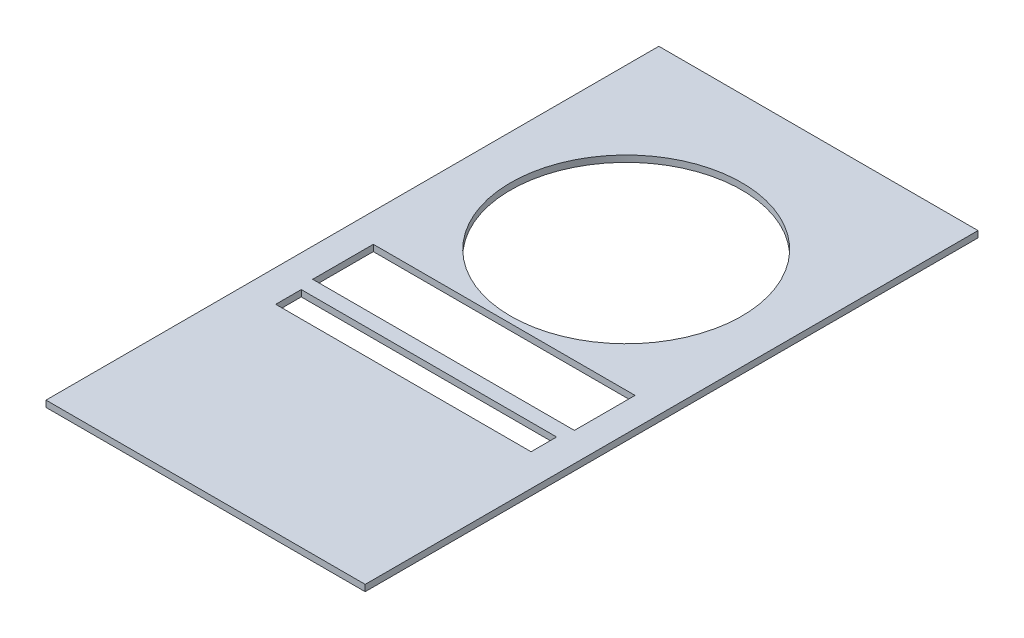
ISO-10303-21;
HEADER;
FILE_DESCRIPTION(('STEP AP214'),'2;1');
FILE_NAME('part.step','',(''),(''),'','','');
FILE_SCHEMA(('AUTOMOTIVE_DESIGN { 1 0 10303 214 1 1 1 1 }'));
ENDSEC;
DATA;
#1=APPLICATION_CONTEXT('core data for automotive mechanical design processes');
#2=APPLICATION_PROTOCOL_DEFINITION('international standard','automotive_design',2000,#1);
#3=PRODUCT_CONTEXT('',#1,'mechanical');
#4=PRODUCT('Part','Part','',(#3));
#5=PRODUCT_RELATED_PRODUCT_CATEGORY('part','',(#4));
#6=PRODUCT_DEFINITION_FORMATION('','',#4);
#7=PRODUCT_DEFINITION_CONTEXT('part definition',#1,'design');
#8=PRODUCT_DEFINITION('design','',#6,#7);
#9=PRODUCT_DEFINITION_SHAPE('','',#8);
#10=(LENGTH_UNIT() NAMED_UNIT(*) SI_UNIT(.MILLI.,.METRE.));
#11=(NAMED_UNIT(*) PLANE_ANGLE_UNIT() SI_UNIT($,.RADIAN.));
#12=(NAMED_UNIT(*) SI_UNIT($,.STERADIAN.) SOLID_ANGLE_UNIT());
#13=UNCERTAINTY_MEASURE_WITH_UNIT(LENGTH_MEASURE(1.E-05),#10,'distance_accuracy_value','');
#14=(GEOMETRIC_REPRESENTATION_CONTEXT(3) GLOBAL_UNCERTAINTY_ASSIGNED_CONTEXT((#13)) GLOBAL_UNIT_ASSIGNED_CONTEXT((#10,
#11,#12)) REPRESENTATION_CONTEXT('',''));
#15=CARTESIAN_POINT('',(0.,0.,0.));
#16=DIRECTION('',(0.,0.,1.));
#17=DIRECTION('',(1.,0.,0.));
#18=AXIS2_PLACEMENT_3D('',#15,#16,#17);
#19=CARTESIAN_POINT('',(0.,3.175,0.));
#20=DIRECTION('',(0.,-1.,0.));
#21=DIRECTION('',(0.,0.,-1.));
#22=AXIS2_PLACEMENT_3D('',#19,#20,#21);
#23=PLANE('',#22);
#24=DIRECTION('',(0.,0.,1.));
#25=VECTOR('',#24,1.);
#26=CARTESIAN_POINT('',(14.2875,3.175,-148.513620025453));
#27=LINE('',#26,#25);
#28=CARTESIAN_POINT('',(14.2875,3.175,-148.513620025453));
#29=VERTEX_POINT('',#28);
#30=CARTESIAN_POINT('',(14.2875,3.175,-118.351120025453));
#31=VERTEX_POINT('',#30);
#32=EDGE_CURVE('E163',#29,#31,#27,.T.);
#33=ORIENTED_EDGE('',*,*,#32,.F.);
#34=DIRECTION('',(-1.,0.,0.));
#35=VECTOR('',#34,1.);
#36=CARTESIAN_POINT('',(14.2875,3.175,-148.513620025453));
#37=LINE('',#36,#35);
#38=CARTESIAN_POINT('',(144.4625,3.175,-148.513620025453));
#39=VERTEX_POINT('',#38);
#40=EDGE_CURVE('E175',#39,#29,#37,.T.);
#41=ORIENTED_EDGE('',*,*,#40,.F.);
#42=DIRECTION('',(0.,0.,-1.));
#43=VECTOR('',#42,1.);
#44=CARTESIAN_POINT('',(144.4625,3.175,-148.513620025453));
#45=LINE('',#44,#43);
#46=CARTESIAN_POINT('',(144.4625,3.175,-118.351120025453));
#47=VERTEX_POINT('',#46);
#48=EDGE_CURVE('E166',#47,#39,#45,.T.);
#49=ORIENTED_EDGE('',*,*,#48,.F.);
#50=DIRECTION('',(1.,0.,0.));
#51=VECTOR('',#50,1.);
#52=CARTESIAN_POINT('',(14.2875,3.175,-118.351120025453));
#53=LINE('',#52,#51);
#54=EDGE_CURVE('E167',#31,#47,#53,.T.);
#55=ORIENTED_EDGE('',*,*,#54,.F.);
#56=EDGE_LOOP('',(#33,#41,#49,#55));
#57=FACE_BOUND('',#56,.T.);
#58=DIRECTION('',(0.,0.,1.));
#59=VECTOR('',#58,1.);
#60=CARTESIAN_POINT('',(0.,3.175,0.));
#61=LINE('',#60,#59);
#62=CARTESIAN_POINT('',(0.,3.175,-304.8));
#63=VERTEX_POINT('',#62);
#64=CARTESIAN_POINT('',(0.,3.175,0.));
#65=VERTEX_POINT('',#64);
#66=EDGE_CURVE('E203',#63,#65,#61,.T.);
#67=ORIENTED_EDGE('',*,*,#66,.T.);
#68=DIRECTION('',(1.,0.,0.));
#69=VECTOR('',#68,1.);
#70=CARTESIAN_POINT('',(0.,3.175,0.));
#71=LINE('',#70,#69);
#72=CARTESIAN_POINT('',(158.75,3.175,0.));
#73=VERTEX_POINT('',#72);
#74=EDGE_CURVE('E204',#65,#73,#71,.T.);
#75=ORIENTED_EDGE('',*,*,#74,.T.);
#76=DIRECTION('',(0.,0.,-1.));
#77=VECTOR('',#76,1.);
#78=CARTESIAN_POINT('',(158.75,3.175,0.));
#79=LINE('',#78,#77);
#80=CARTESIAN_POINT('',(158.75,3.175,-304.8));
#81=VERTEX_POINT('',#80);
#82=EDGE_CURVE('E210',#73,#81,#79,.T.);
#83=ORIENTED_EDGE('',*,*,#82,.T.);
#84=DIRECTION('',(-1.,0.,0.));
#85=VECTOR('',#84,1.);
#86=CARTESIAN_POINT('',(0.,3.175,-304.8));
#87=LINE('',#86,#85);
#88=EDGE_CURVE('E207',#81,#63,#87,.T.);
#89=ORIENTED_EDGE('',*,*,#88,.T.);
#90=EDGE_LOOP('',(#67,#75,#83,#89));
#91=FACE_BOUND('',#90,.T.);
#92=CARTESIAN_POINT('',(79.375,3.175,-209.2));
#93=DIRECTION('',(0.,1.,0.));
#94=DIRECTION('',(0.,0.,1.));
#95=AXIS2_PLACEMENT_3D('',#92,#93,#94);
#96=CIRCLE('',#95,57.5);
#97=CARTESIAN_POINT('',(79.375,3.175,-151.7));
#98=VERTEX_POINT('',#97);
#99=EDGE_CURVE('E193',#98,#98,#96,.T.);
#100=ORIENTED_EDGE('',*,*,#99,.F.);
#101=EDGE_LOOP('',(#100));
#102=FACE_BOUND('',#101,.T.);
#103=DIRECTION('',(0.,0.,1.));
#104=VECTOR('',#103,1.);
#105=CARTESIAN_POINT('',(15.875,3.175,-98.3841921115399));
#106=LINE('',#105,#104);
#107=CARTESIAN_POINT('',(15.875,3.175,-111.08419211154));
#108=VERTEX_POINT('',#107);
#109=CARTESIAN_POINT('',(15.875,3.175,-98.3841921115399));
#110=VERTEX_POINT('',#109);
#111=EDGE_CURVE('E126',#108,#110,#106,.T.);
#112=ORIENTED_EDGE('',*,*,#111,.F.);
#113=DIRECTION('',(-1.,0.,0.));
#114=VECTOR('',#113,1.);
#115=CARTESIAN_POINT('',(15.875,3.175,-111.08419211154));
#116=LINE('',#115,#114);
#117=CARTESIAN_POINT('',(142.875,3.175,-111.08419211154));
#118=VERTEX_POINT('',#117);
#119=EDGE_CURVE('E147',#118,#108,#116,.T.);
#120=ORIENTED_EDGE('',*,*,#119,.F.);
#121=DIRECTION('',(0.,0.,-1.));
#122=VECTOR('',#121,1.);
#123=CARTESIAN_POINT('',(142.875,3.175,-98.3841921115399));
#124=LINE('',#123,#122);
#125=CARTESIAN_POINT('',(142.875,3.175,-98.3841921115399));
#126=VERTEX_POINT('',#125);
#127=EDGE_CURVE('E146',#126,#118,#124,.T.);
#128=ORIENTED_EDGE('',*,*,#127,.F.);
#129=DIRECTION('',(1.,0.,0.));
#130=VECTOR('',#129,1.);
#131=CARTESIAN_POINT('',(15.875,3.175,-98.3841921115399));
#132=LINE('',#131,#130);
#133=EDGE_CURVE('E137',#110,#126,#132,.T.);
#134=ORIENTED_EDGE('',*,*,#133,.F.);
#135=EDGE_LOOP('',(#112,#120,#128,#134));
#136=FACE_BOUND('',#135,.T.);
#137=ADVANCED_FACE('F39',(#57,#91,#102,#136),#23,.F.);
#138=CARTESIAN_POINT('',(0.,0.,0.));
#139=DIRECTION('',(0.,-1.,0.));
#140=DIRECTION('',(0.,0.,-1.));
#141=AXIS2_PLACEMENT_3D('',#138,#139,#140);
#142=PLANE('',#141);
#143=DIRECTION('',(0.,0.,1.));
#144=VECTOR('',#143,1.);
#145=CARTESIAN_POINT('',(0.,0.,0.));
#146=LINE('',#145,#144);
#147=CARTESIAN_POINT('',(0.,0.,-304.8));
#148=VERTEX_POINT('',#147);
#149=CARTESIAN_POINT('',(0.,0.,0.));
#150=VERTEX_POINT('',#149);
#151=EDGE_CURVE('E196',#148,#150,#146,.T.);
#152=ORIENTED_EDGE('',*,*,#151,.F.);
#153=DIRECTION('',(-1.,0.,0.));
#154=VECTOR('',#153,1.);
#155=CARTESIAN_POINT('',(0.,0.,-304.8));
#156=LINE('',#155,#154);
#157=CARTESIAN_POINT('',(158.75,0.,-304.8));
#158=VERTEX_POINT('',#157);
#159=EDGE_CURVE('E202',#158,#148,#156,.T.);
#160=ORIENTED_EDGE('',*,*,#159,.F.);
#161=DIRECTION('',(0.,0.,-1.));
#162=VECTOR('',#161,1.);
#163=CARTESIAN_POINT('',(158.75,0.,0.));
#164=LINE('',#163,#162);
#165=CARTESIAN_POINT('',(158.75,0.,0.));
#166=VERTEX_POINT('',#165);
#167=EDGE_CURVE('E216',#166,#158,#164,.T.);
#168=ORIENTED_EDGE('',*,*,#167,.F.);
#169=DIRECTION('',(1.,0.,0.));
#170=VECTOR('',#169,1.);
#171=CARTESIAN_POINT('',(0.,0.,0.));
#172=LINE('',#171,#170);
#173=EDGE_CURVE('E212',#150,#166,#172,.T.);
#174=ORIENTED_EDGE('',*,*,#173,.F.);
#175=EDGE_LOOP('',(#152,#160,#168,#174));
#176=FACE_BOUND('',#175,.T.);
#177=CARTESIAN_POINT('',(79.375,0.,-209.2));
#178=DIRECTION('',(0.,1.,0.));
#179=DIRECTION('',(0.,0.,1.));
#180=AXIS2_PLACEMENT_3D('',#177,#178,#179);
#181=CIRCLE('',#180,57.5);
#182=CARTESIAN_POINT('',(79.375,0.,-151.7));
#183=VERTEX_POINT('',#182);
#184=EDGE_CURVE('E191',#183,#183,#181,.T.);
#185=ORIENTED_EDGE('',*,*,#184,.T.);
#186=EDGE_LOOP('',(#185));
#187=FACE_BOUND('',#186,.T.);
#188=DIRECTION('',(-1.,0.,0.));
#189=VECTOR('',#188,1.);
#190=CARTESIAN_POINT('',(14.2875,0.,-148.513620025453));
#191=LINE('',#190,#189);
#192=CARTESIAN_POINT('',(144.4625,0.,-148.513620025453));
#193=VERTEX_POINT('',#192);
#194=CARTESIAN_POINT('',(14.2875,0.,-148.513620025453));
#195=VERTEX_POINT('',#194);
#196=EDGE_CURVE('E170',#193,#195,#191,.T.);
#197=ORIENTED_EDGE('',*,*,#196,.T.);
#198=DIRECTION('',(0.,0.,1.));
#199=VECTOR('',#198,1.);
#200=CARTESIAN_POINT('',(14.2875,0.,-148.513620025453));
#201=LINE('',#200,#199);
#202=CARTESIAN_POINT('',(14.2875,0.,-118.351120025453));
#203=VERTEX_POINT('',#202);
#204=EDGE_CURVE('E145',#195,#203,#201,.T.);
#205=ORIENTED_EDGE('',*,*,#204,.T.);
#206=DIRECTION('',(1.,0.,0.));
#207=VECTOR('',#206,1.);
#208=CARTESIAN_POINT('',(14.2875,0.,-118.351120025453));
#209=LINE('',#208,#207);
#210=CARTESIAN_POINT('',(144.4625,0.,-118.351120025453));
#211=VERTEX_POINT('',#210);
#212=EDGE_CURVE('E179',#203,#211,#209,.T.);
#213=ORIENTED_EDGE('',*,*,#212,.T.);
#214=DIRECTION('',(0.,0.,-1.));
#215=VECTOR('',#214,1.);
#216=CARTESIAN_POINT('',(144.4625,0.,-148.513620025453));
#217=LINE('',#216,#215);
#218=EDGE_CURVE('E178',#211,#193,#217,.T.);
#219=ORIENTED_EDGE('',*,*,#218,.T.);
#220=EDGE_LOOP('',(#197,#205,#213,#219));
#221=FACE_BOUND('',#220,.T.);
#222=DIRECTION('',(-1.,0.,0.));
#223=VECTOR('',#222,1.);
#224=CARTESIAN_POINT('',(15.875,0.,-111.08419211154));
#225=LINE('',#224,#223);
#226=CARTESIAN_POINT('',(142.875,0.,-111.08419211154));
#227=VERTEX_POINT('',#226);
#228=CARTESIAN_POINT('',(15.875,0.,-111.08419211154));
#229=VERTEX_POINT('',#228);
#230=EDGE_CURVE('E139',#227,#229,#225,.T.);
#231=ORIENTED_EDGE('',*,*,#230,.T.);
#232=DIRECTION('',(0.,0.,1.));
#233=VECTOR('',#232,1.);
#234=CARTESIAN_POINT('',(15.875,0.,-98.3841921115399));
#235=LINE('',#234,#233);
#236=CARTESIAN_POINT('',(15.875,0.,-98.3841921115399));
#237=VERTEX_POINT('',#236);
#238=EDGE_CURVE('E65',#229,#237,#235,.T.);
#239=ORIENTED_EDGE('',*,*,#238,.T.);
#240=DIRECTION('',(1.,0.,0.));
#241=VECTOR('',#240,1.);
#242=CARTESIAN_POINT('',(15.875,0.,-98.3841921115399));
#243=LINE('',#242,#241);
#244=CARTESIAN_POINT('',(142.875,0.,-98.3841921115399));
#245=VERTEX_POINT('',#244);
#246=EDGE_CURVE('E141',#237,#245,#243,.T.);
#247=ORIENTED_EDGE('',*,*,#246,.T.);
#248=DIRECTION('',(0.,0.,-1.));
#249=VECTOR('',#248,1.);
#250=CARTESIAN_POINT('',(142.875,0.,-98.3841921115399));
#251=LINE('',#250,#249);
#252=EDGE_CURVE('E156',#245,#227,#251,.T.);
#253=ORIENTED_EDGE('',*,*,#252,.T.);
#254=EDGE_LOOP('',(#231,#239,#247,#253));
#255=FACE_BOUND('',#254,.T.);
#256=ADVANCED_FACE('F231',(#176,#187,#221,#255),#142,.T.);
#257=CARTESIAN_POINT('',(0.,3.175,0.));
#258=DIRECTION('',(1.,0.,0.));
#259=DIRECTION('',(0.,0.,-1.));
#260=AXIS2_PLACEMENT_3D('',#257,#258,#259);
#261=PLANE('',#260);
#262=ORIENTED_EDGE('',*,*,#151,.T.);
#263=DIRECTION('',(0.,-1.,0.));
#264=VECTOR('',#263,1.);
#265=CARTESIAN_POINT('',(0.,3.175,0.));
#266=LINE('',#265,#264);
#267=EDGE_CURVE('E11',#65,#150,#266,.T.);
#268=ORIENTED_EDGE('',*,*,#267,.F.);
#269=ORIENTED_EDGE('',*,*,#66,.F.);
#270=DIRECTION('',(0.,-1.,0.));
#271=VECTOR('',#270,1.);
#272=CARTESIAN_POINT('',(0.,3.175,-304.8));
#273=LINE('',#272,#271);
#274=EDGE_CURVE('E211',#63,#148,#273,.T.);
#275=ORIENTED_EDGE('',*,*,#274,.T.);
#276=EDGE_LOOP('',(#262,#268,#269,#275));
#277=FACE_BOUND('',#276,.T.);
#278=ADVANCED_FACE('F41',(#277),#261,.F.);
#279=CARTESIAN_POINT('',(0.,3.175,0.));
#280=DIRECTION('',(0.,0.,-1.));
#281=DIRECTION('',(-1.,0.,0.));
#282=AXIS2_PLACEMENT_3D('',#279,#280,#281);
#283=PLANE('',#282);
#284=ORIENTED_EDGE('',*,*,#173,.T.);
#285=DIRECTION('',(0.,-1.,0.));
#286=VECTOR('',#285,1.);
#287=CARTESIAN_POINT('',(158.75,3.175,0.));
#288=LINE('',#287,#286);
#289=EDGE_CURVE('E50',#73,#166,#288,.T.);
#290=ORIENTED_EDGE('',*,*,#289,.F.);
#291=ORIENTED_EDGE('',*,*,#74,.F.);
#292=ORIENTED_EDGE('',*,*,#267,.T.);
#293=EDGE_LOOP('',(#284,#290,#291,#292));
#294=FACE_BOUND('',#293,.T.);
#295=ADVANCED_FACE('F243',(#294),#283,.F.);
#296=CARTESIAN_POINT('',(158.75,3.175,0.));
#297=DIRECTION('',(-1.,0.,0.));
#298=DIRECTION('',(0.,0.,1.));
#299=AXIS2_PLACEMENT_3D('',#296,#297,#298);
#300=PLANE('',#299);
#301=ORIENTED_EDGE('',*,*,#167,.T.);
#302=DIRECTION('',(0.,-1.,0.));
#303=VECTOR('',#302,1.);
#304=CARTESIAN_POINT('',(158.75,3.175,-304.8));
#305=LINE('',#304,#303);
#306=EDGE_CURVE('E222',#81,#158,#305,.T.);
#307=ORIENTED_EDGE('',*,*,#306,.F.);
#308=ORIENTED_EDGE('',*,*,#82,.F.);
#309=ORIENTED_EDGE('',*,*,#289,.T.);
#310=EDGE_LOOP('',(#301,#307,#308,#309));
#311=FACE_BOUND('',#310,.T.);
#312=ADVANCED_FACE('F229',(#311),#300,.F.);
#313=CARTESIAN_POINT('',(0.,3.175,-304.8));
#314=DIRECTION('',(0.,0.,1.));
#315=DIRECTION('',(1.,0.,0.));
#316=AXIS2_PLACEMENT_3D('',#313,#314,#315);
#317=PLANE('',#316);
#318=ORIENTED_EDGE('',*,*,#159,.T.);
#319=ORIENTED_EDGE('',*,*,#274,.F.);
#320=ORIENTED_EDGE('',*,*,#88,.F.);
#321=ORIENTED_EDGE('',*,*,#306,.T.);
#322=EDGE_LOOP('',(#318,#319,#320,#321));
#323=FACE_BOUND('',#322,.T.);
#324=ADVANCED_FACE('F236',(#323),#317,.F.);
#325=CARTESIAN_POINT('',(79.375,3.175,-209.2));
#326=DIRECTION('',(0.,-1.,0.));
#327=DIRECTION('',(0.,0.,-1.));
#328=AXIS2_PLACEMENT_3D('',#325,#326,#327);
#329=CYLINDRICAL_SURFACE('',#328,57.5);
#330=ORIENTED_EDGE('',*,*,#99,.T.);
#331=EDGE_LOOP('',(#330));
#332=FACE_BOUND('',#331,.T.);
#333=ORIENTED_EDGE('',*,*,#184,.F.);
#334=EDGE_LOOP('',(#333));
#335=FACE_BOUND('',#334,.T.);
#336=ADVANCED_FACE('F261',(#332,#335),#329,.F.);
#337=CARTESIAN_POINT('',(14.2875,3.175,-148.513620025453));
#338=DIRECTION('',(1.,0.,0.));
#339=DIRECTION('',(0.,0.,-1.));
#340=AXIS2_PLACEMENT_3D('',#337,#338,#339);
#341=PLANE('',#340);
#342=ORIENTED_EDGE('',*,*,#204,.F.);
#343=DIRECTION('',(0.,-1.,0.));
#344=VECTOR('',#343,1.);
#345=CARTESIAN_POINT('',(14.2875,3.175,-148.513620025453));
#346=LINE('',#345,#344);
#347=EDGE_CURVE('E171',#29,#195,#346,.T.);
#348=ORIENTED_EDGE('',*,*,#347,.F.);
#349=ORIENTED_EDGE('',*,*,#32,.T.);
#350=DIRECTION('',(0.,-1.,0.));
#351=VECTOR('',#350,1.);
#352=CARTESIAN_POINT('',(14.2875,3.175,-118.351120025453));
#353=LINE('',#352,#351);
#354=EDGE_CURVE('E192',#31,#203,#353,.T.);
#355=ORIENTED_EDGE('',*,*,#354,.T.);
#356=EDGE_LOOP('',(#342,#348,#349,#355));
#357=FACE_BOUND('',#356,.T.);
#358=ADVANCED_FACE('F268',(#357),#341,.T.);
#359=CARTESIAN_POINT('',(14.2875,3.175,-118.351120025453));
#360=DIRECTION('',(0.,0.,-1.));
#361=DIRECTION('',(-1.,0.,0.));
#362=AXIS2_PLACEMENT_3D('',#359,#360,#361);
#363=PLANE('',#362);
#364=ORIENTED_EDGE('',*,*,#212,.F.);
#365=ORIENTED_EDGE('',*,*,#354,.F.);
#366=ORIENTED_EDGE('',*,*,#54,.T.);
#367=DIRECTION('',(0.,-1.,0.));
#368=VECTOR('',#367,1.);
#369=CARTESIAN_POINT('',(144.4625,3.175,-118.351120025453));
#370=LINE('',#369,#368);
#371=EDGE_CURVE('E186',#47,#211,#370,.T.);
#372=ORIENTED_EDGE('',*,*,#371,.T.);
#373=EDGE_LOOP('',(#364,#365,#366,#372));
#374=FACE_BOUND('',#373,.T.);
#375=ADVANCED_FACE('F272',(#374),#363,.T.);
#376=CARTESIAN_POINT('',(144.4625,3.175,-148.513620025453));
#377=DIRECTION('',(-1.,0.,0.));
#378=DIRECTION('',(0.,0.,1.));
#379=AXIS2_PLACEMENT_3D('',#376,#377,#378);
#380=PLANE('',#379);
#381=ORIENTED_EDGE('',*,*,#218,.F.);
#382=ORIENTED_EDGE('',*,*,#371,.F.);
#383=ORIENTED_EDGE('',*,*,#48,.T.);
#384=DIRECTION('',(0.,-1.,0.));
#385=VECTOR('',#384,1.);
#386=CARTESIAN_POINT('',(144.4625,3.175,-148.513620025453));
#387=LINE('',#386,#385);
#388=EDGE_CURVE('E190',#39,#193,#387,.T.);
#389=ORIENTED_EDGE('',*,*,#388,.T.);
#390=EDGE_LOOP('',(#381,#382,#383,#389));
#391=FACE_BOUND('',#390,.T.);
#392=ADVANCED_FACE('F296',(#391),#380,.T.);
#393=CARTESIAN_POINT('',(14.2875,3.175,-148.513620025453));
#394=DIRECTION('',(0.,0.,1.));
#395=DIRECTION('',(1.,0.,0.));
#396=AXIS2_PLACEMENT_3D('',#393,#394,#395);
#397=PLANE('',#396);
#398=ORIENTED_EDGE('',*,*,#196,.F.);
#399=ORIENTED_EDGE('',*,*,#388,.F.);
#400=ORIENTED_EDGE('',*,*,#40,.T.);
#401=ORIENTED_EDGE('',*,*,#347,.T.);
#402=EDGE_LOOP('',(#398,#399,#400,#401));
#403=FACE_BOUND('',#402,.T.);
#404=ADVANCED_FACE('F297',(#403),#397,.T.);
#405=CARTESIAN_POINT('',(15.875,3.175,-98.3841921115399));
#406=DIRECTION('',(1.,0.,0.));
#407=DIRECTION('',(0.,0.,-1.));
#408=AXIS2_PLACEMENT_3D('',#405,#406,#407);
#409=PLANE('',#408);
#410=ORIENTED_EDGE('',*,*,#238,.F.);
#411=DIRECTION('',(0.,-1.,0.));
#412=VECTOR('',#411,1.);
#413=CARTESIAN_POINT('',(15.875,3.175,-111.08419211154));
#414=LINE('',#413,#412);
#415=EDGE_CURVE('E135',#108,#229,#414,.T.);
#416=ORIENTED_EDGE('',*,*,#415,.F.);
#417=ORIENTED_EDGE('',*,*,#111,.T.);
#418=DIRECTION('',(0.,-1.,0.));
#419=VECTOR('',#418,1.);
#420=CARTESIAN_POINT('',(15.875,3.175,-98.3841921115399));
#421=LINE('',#420,#419);
#422=EDGE_CURVE('E132',#110,#237,#421,.T.);
#423=ORIENTED_EDGE('',*,*,#422,.T.);
#424=EDGE_LOOP('',(#410,#416,#417,#423));
#425=FACE_BOUND('',#424,.T.);
#426=ADVANCED_FACE('F128',(#425),#409,.T.);
#427=CARTESIAN_POINT('',(15.875,3.175,-98.3841921115399));
#428=DIRECTION('',(0.,0.,-1.));
#429=DIRECTION('',(-1.,0.,0.));
#430=AXIS2_PLACEMENT_3D('',#427,#428,#429);
#431=PLANE('',#430);
#432=ORIENTED_EDGE('',*,*,#246,.F.);
#433=ORIENTED_EDGE('',*,*,#422,.F.);
#434=ORIENTED_EDGE('',*,*,#133,.T.);
#435=DIRECTION('',(0.,-1.,0.));
#436=VECTOR('',#435,1.);
#437=CARTESIAN_POINT('',(142.875,3.175,-98.3841921115399));
#438=LINE('',#437,#436);
#439=EDGE_CURVE('E144',#126,#245,#438,.T.);
#440=ORIENTED_EDGE('',*,*,#439,.T.);
#441=EDGE_LOOP('',(#432,#433,#434,#440));
#442=FACE_BOUND('',#441,.T.);
#443=ADVANCED_FACE('F138',(#442),#431,.T.);
#444=CARTESIAN_POINT('',(142.875,3.175,-98.3841921115399));
#445=DIRECTION('',(-1.,0.,0.));
#446=DIRECTION('',(0.,0.,1.));
#447=AXIS2_PLACEMENT_3D('',#444,#445,#446);
#448=PLANE('',#447);
#449=ORIENTED_EDGE('',*,*,#252,.F.);
#450=ORIENTED_EDGE('',*,*,#439,.F.);
#451=ORIENTED_EDGE('',*,*,#127,.T.);
#452=DIRECTION('',(0.,-1.,0.));
#453=VECTOR('',#452,1.);
#454=CARTESIAN_POINT('',(142.875,3.175,-111.08419211154));
#455=LINE('',#454,#453);
#456=EDGE_CURVE('E53',#118,#227,#455,.T.);
#457=ORIENTED_EDGE('',*,*,#456,.T.);
#458=EDGE_LOOP('',(#449,#450,#451,#457));
#459=FACE_BOUND('',#458,.T.);
#460=ADVANCED_FACE('F281',(#459),#448,.T.);
#461=CARTESIAN_POINT('',(15.875,3.175,-111.08419211154));
#462=DIRECTION('',(0.,0.,1.));
#463=DIRECTION('',(1.,0.,0.));
#464=AXIS2_PLACEMENT_3D('',#461,#462,#463);
#465=PLANE('',#464);
#466=ORIENTED_EDGE('',*,*,#230,.F.);
#467=ORIENTED_EDGE('',*,*,#456,.F.);
#468=ORIENTED_EDGE('',*,*,#119,.T.);
#469=ORIENTED_EDGE('',*,*,#415,.T.);
#470=EDGE_LOOP('',(#466,#467,#468,#469));
#471=FACE_BOUND('',#470,.T.);
#472=ADVANCED_FACE('F285',(#471),#465,.T.);
#473=CLOSED_SHELL('',(#137,#256,#278,#295,#312,#324,#336,#358,#375,#392,#404,#426,#443,#460,#472));
#474=MANIFOLD_SOLID_BREP('B2',#473);
#475=ADVANCED_BREP_SHAPE_REPRESENTATION('',(#18,#474),#14);
#476=SHAPE_DEFINITION_REPRESENTATION(#9,#475);
ENDSEC;
END-ISO-10303-21;
